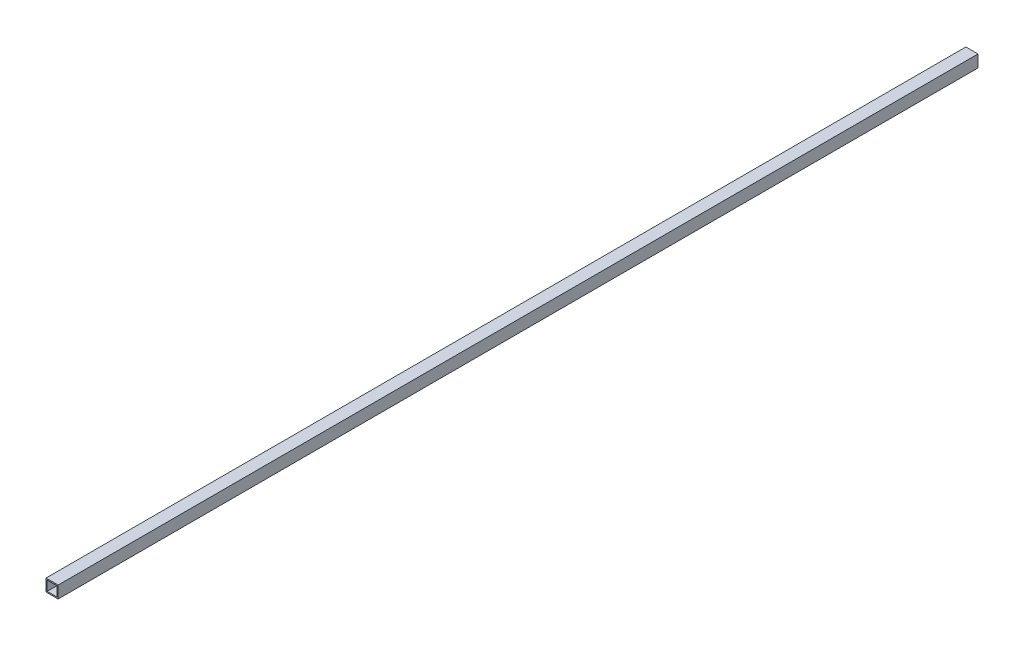
ISO-10303-21;
HEADER;
FILE_DESCRIPTION(('STEP AP214'),'2;1');
FILE_NAME('part.step','',(''),(''),'','','');
FILE_SCHEMA(('AUTOMOTIVE_DESIGN { 1 0 10303 214 1 1 1 1 }'));
ENDSEC;
DATA;
#1=APPLICATION_CONTEXT('core data for automotive mechanical design processes');
#2=APPLICATION_PROTOCOL_DEFINITION('international standard','automotive_design',2000,#1);
#3=PRODUCT_CONTEXT('',#1,'mechanical');
#4=PRODUCT('Part','Part','',(#3));
#5=PRODUCT_RELATED_PRODUCT_CATEGORY('part','',(#4));
#6=PRODUCT_DEFINITION_FORMATION('','',#4);
#7=PRODUCT_DEFINITION_CONTEXT('part definition',#1,'design');
#8=PRODUCT_DEFINITION('design','',#6,#7);
#9=PRODUCT_DEFINITION_SHAPE('','',#8);
#10=(LENGTH_UNIT() NAMED_UNIT(*) SI_UNIT(.MILLI.,.METRE.));
#11=(NAMED_UNIT(*) PLANE_ANGLE_UNIT() SI_UNIT($,.RADIAN.));
#12=(NAMED_UNIT(*) SI_UNIT($,.STERADIAN.) SOLID_ANGLE_UNIT());
#13=UNCERTAINTY_MEASURE_WITH_UNIT(LENGTH_MEASURE(1.E-05),#10,'distance_accuracy_value','');
#14=(GEOMETRIC_REPRESENTATION_CONTEXT(3) GLOBAL_UNCERTAINTY_ASSIGNED_CONTEXT((#13)) GLOBAL_UNIT_ASSIGNED_CONTEXT((#10,
#11,#12)) REPRESENTATION_CONTEXT('',''));
#15=CARTESIAN_POINT('',(0.,0.,0.));
#16=DIRECTION('',(0.,0.,1.));
#17=DIRECTION('',(1.,0.,0.));
#18=AXIS2_PLACEMENT_3D('',#15,#16,#17);
#19=CARTESIAN_POINT('',(0.,0.,781.));
#20=DIRECTION('',(0.,0.,1.));
#21=DIRECTION('',(1.,0.,0.));
#22=AXIS2_PLACEMENT_3D('',#19,#20,#21);
#23=PLANE('',#22);
#24=DIRECTION('',(1.,0.,0.));
#25=VECTOR('',#24,1.);
#26=CARTESIAN_POINT('',(-5.15,-5.15,781.));
#27=LINE('',#26,#25);
#28=CARTESIAN_POINT('',(-5.15,-5.15,781.));
#29=VERTEX_POINT('',#28);
#30=CARTESIAN_POINT('',(5.15,-5.15,781.));
#31=VERTEX_POINT('',#30);
#32=EDGE_CURVE('E134',#29,#31,#27,.T.);
#33=ORIENTED_EDGE('',*,*,#32,.T.);
#34=DIRECTION('',(0.,1.,0.));
#35=VECTOR('',#34,1.);
#36=CARTESIAN_POINT('',(5.15,-5.15,781.));
#37=LINE('',#36,#35);
#38=CARTESIAN_POINT('',(5.15,5.15,781.));
#39=VERTEX_POINT('',#38);
#40=EDGE_CURVE('E137',#31,#39,#37,.T.);
#41=ORIENTED_EDGE('',*,*,#40,.T.);
#42=DIRECTION('',(-1.,0.,0.));
#43=VECTOR('',#42,1.);
#44=CARTESIAN_POINT('',(-5.15,5.15,781.));
#45=LINE('',#44,#43);
#46=CARTESIAN_POINT('',(-5.15,5.15,781.));
#47=VERTEX_POINT('',#46);
#48=EDGE_CURVE('E140',#39,#47,#45,.T.);
#49=ORIENTED_EDGE('',*,*,#48,.T.);
#50=DIRECTION('',(0.,-1.,0.));
#51=VECTOR('',#50,1.);
#52=CARTESIAN_POINT('',(-5.15,-5.15,781.));
#53=LINE('',#52,#51);
#54=EDGE_CURVE('E142',#47,#29,#53,.T.);
#55=ORIENTED_EDGE('',*,*,#54,.T.);
#56=EDGE_LOOP('',(#33,#41,#49,#55));
#57=FACE_BOUND('',#56,.T.);
#58=DIRECTION('',(-1.,0.,0.));
#59=VECTOR('',#58,1.);
#60=CARTESIAN_POINT('',(-4.15,4.15,781.));
#61=LINE('',#60,#59);
#62=CARTESIAN_POINT('',(4.15,4.15,781.));
#63=VERTEX_POINT('',#62);
#64=CARTESIAN_POINT('',(-4.15,4.15,781.));
#65=VERTEX_POINT('',#64);
#66=EDGE_CURVE('E106',#63,#65,#61,.T.);
#67=ORIENTED_EDGE('',*,*,#66,.F.);
#68=DIRECTION('',(0.,1.,0.));
#69=VECTOR('',#68,1.);
#70=CARTESIAN_POINT('',(4.15,-4.15,781.));
#71=LINE('',#70,#69);
#72=CARTESIAN_POINT('',(4.15,-4.15,781.));
#73=VERTEX_POINT('',#72);
#74=EDGE_CURVE('E98',#73,#63,#71,.T.);
#75=ORIENTED_EDGE('',*,*,#74,.F.);
#76=DIRECTION('',(1.,0.,0.));
#77=VECTOR('',#76,1.);
#78=CARTESIAN_POINT('',(-4.15,-4.15,781.));
#79=LINE('',#78,#77);
#80=CARTESIAN_POINT('',(-4.15,-4.15,781.));
#81=VERTEX_POINT('',#80);
#82=EDGE_CURVE('E120',#81,#73,#79,.T.);
#83=ORIENTED_EDGE('',*,*,#82,.F.);
#84=DIRECTION('',(0.,-1.,0.));
#85=VECTOR('',#84,1.);
#86=CARTESIAN_POINT('',(-4.15,-4.15,781.));
#87=LINE('',#86,#85);
#88=EDGE_CURVE('E118',#65,#81,#87,.T.);
#89=ORIENTED_EDGE('',*,*,#88,.F.);
#90=EDGE_LOOP('',(#67,#75,#83,#89));
#91=FACE_BOUND('',#90,.T.);
#92=ADVANCED_FACE('F33',(#57,#91),#23,.T.);
#93=CARTESIAN_POINT('',(0.,0.,0.));
#94=DIRECTION('',(0.,0.,1.));
#95=DIRECTION('',(1.,0.,0.));
#96=AXIS2_PLACEMENT_3D('',#93,#94,#95);
#97=PLANE('',#96);
#98=DIRECTION('',(1.,0.,0.));
#99=VECTOR('',#98,1.);
#100=CARTESIAN_POINT('',(-5.15,-5.15,0.));
#101=LINE('',#100,#99);
#102=CARTESIAN_POINT('',(-5.15,-5.15,0.));
#103=VERTEX_POINT('',#102);
#104=CARTESIAN_POINT('',(5.15,-5.15,0.));
#105=VERTEX_POINT('',#104);
#106=EDGE_CURVE('E114',#103,#105,#101,.T.);
#107=ORIENTED_EDGE('',*,*,#106,.F.);
#108=DIRECTION('',(0.,-1.,0.));
#109=VECTOR('',#108,1.);
#110=CARTESIAN_POINT('',(-5.15,-5.15,0.));
#111=LINE('',#110,#109);
#112=CARTESIAN_POINT('',(-5.15,5.15,0.));
#113=VERTEX_POINT('',#112);
#114=EDGE_CURVE('E138',#113,#103,#111,.T.);
#115=ORIENTED_EDGE('',*,*,#114,.F.);
#116=DIRECTION('',(-1.,0.,0.));
#117=VECTOR('',#116,1.);
#118=CARTESIAN_POINT('',(-5.15,5.15,0.));
#119=LINE('',#118,#117);
#120=CARTESIAN_POINT('',(5.15,5.15,0.));
#121=VERTEX_POINT('',#120);
#122=EDGE_CURVE('E149',#121,#113,#119,.T.);
#123=ORIENTED_EDGE('',*,*,#122,.F.);
#124=DIRECTION('',(0.,1.,0.));
#125=VECTOR('',#124,1.);
#126=CARTESIAN_POINT('',(5.15,-5.15,0.));
#127=LINE('',#126,#125);
#128=EDGE_CURVE('E147',#105,#121,#127,.T.);
#129=ORIENTED_EDGE('',*,*,#128,.F.);
#130=EDGE_LOOP('',(#107,#115,#123,#129));
#131=FACE_BOUND('',#130,.T.);
#132=DIRECTION('',(0.,1.,0.));
#133=VECTOR('',#132,1.);
#134=CARTESIAN_POINT('',(4.15,-4.15,0.));
#135=LINE('',#134,#133);
#136=CARTESIAN_POINT('',(4.15,-4.15,0.));
#137=VERTEX_POINT('',#136);
#138=CARTESIAN_POINT('',(4.15,4.15,0.));
#139=VERTEX_POINT('',#138);
#140=EDGE_CURVE('E56',#137,#139,#135,.T.);
#141=ORIENTED_EDGE('',*,*,#140,.T.);
#142=DIRECTION('',(-1.,0.,0.));
#143=VECTOR('',#142,1.);
#144=CARTESIAN_POINT('',(-4.15,4.15,0.));
#145=LINE('',#144,#143);
#146=CARTESIAN_POINT('',(-4.15,4.15,0.));
#147=VERTEX_POINT('',#146);
#148=EDGE_CURVE('E113',#139,#147,#145,.T.);
#149=ORIENTED_EDGE('',*,*,#148,.T.);
#150=DIRECTION('',(0.,-1.,0.));
#151=VECTOR('',#150,1.);
#152=CARTESIAN_POINT('',(-4.15,-4.15,0.));
#153=LINE('',#152,#151);
#154=CARTESIAN_POINT('',(-4.15,-4.15,0.));
#155=VERTEX_POINT('',#154);
#156=EDGE_CURVE('E126',#147,#155,#153,.T.);
#157=ORIENTED_EDGE('',*,*,#156,.T.);
#158=DIRECTION('',(1.,0.,0.));
#159=VECTOR('',#158,1.);
#160=CARTESIAN_POINT('',(-4.15,-4.15,0.));
#161=LINE('',#160,#159);
#162=EDGE_CURVE('E107',#155,#137,#161,.T.);
#163=ORIENTED_EDGE('',*,*,#162,.T.);
#164=EDGE_LOOP('',(#141,#149,#157,#163));
#165=FACE_BOUND('',#164,.T.);
#166=ADVANCED_FACE('F167',(#131,#165),#97,.F.);
#167=CARTESIAN_POINT('',(-5.15,-5.15,781.));
#168=DIRECTION('',(0.,1.,0.));
#169=DIRECTION('',(0.,0.,1.));
#170=AXIS2_PLACEMENT_3D('',#167,#168,#169);
#171=PLANE('',#170);
#172=ORIENTED_EDGE('',*,*,#106,.T.);
#173=DIRECTION('',(0.,0.,-1.));
#174=VECTOR('',#173,1.);
#175=CARTESIAN_POINT('',(5.15,-5.15,781.));
#176=LINE('',#175,#174);
#177=EDGE_CURVE('E11',#31,#105,#176,.T.);
#178=ORIENTED_EDGE('',*,*,#177,.F.);
#179=ORIENTED_EDGE('',*,*,#32,.F.);
#180=DIRECTION('',(0.,0.,-1.));
#181=VECTOR('',#180,1.);
#182=CARTESIAN_POINT('',(-5.15,-5.15,781.));
#183=LINE('',#182,#181);
#184=EDGE_CURVE('E144',#29,#103,#183,.T.);
#185=ORIENTED_EDGE('',*,*,#184,.T.);
#186=EDGE_LOOP('',(#172,#178,#179,#185));
#187=FACE_BOUND('',#186,.T.);
#188=ADVANCED_FACE('F35',(#187),#171,.F.);
#189=CARTESIAN_POINT('',(5.15,-5.15,781.));
#190=DIRECTION('',(-1.,0.,0.));
#191=DIRECTION('',(0.,0.,1.));
#192=AXIS2_PLACEMENT_3D('',#189,#190,#191);
#193=PLANE('',#192);
#194=ORIENTED_EDGE('',*,*,#128,.T.);
#195=DIRECTION('',(0.,0.,-1.));
#196=VECTOR('',#195,1.);
#197=CARTESIAN_POINT('',(5.15,5.15,781.));
#198=LINE('',#197,#196);
#199=EDGE_CURVE('E41',#39,#121,#198,.T.);
#200=ORIENTED_EDGE('',*,*,#199,.F.);
#201=ORIENTED_EDGE('',*,*,#40,.F.);
#202=ORIENTED_EDGE('',*,*,#177,.T.);
#203=EDGE_LOOP('',(#194,#200,#201,#202));
#204=FACE_BOUND('',#203,.T.);
#205=ADVANCED_FACE('F177',(#204),#193,.F.);
#206=CARTESIAN_POINT('',(-5.15,5.15,781.));
#207=DIRECTION('',(0.,-1.,0.));
#208=DIRECTION('',(0.,0.,-1.));
#209=AXIS2_PLACEMENT_3D('',#206,#207,#208);
#210=PLANE('',#209);
#211=ORIENTED_EDGE('',*,*,#122,.T.);
#212=DIRECTION('',(0.,0.,-1.));
#213=VECTOR('',#212,1.);
#214=CARTESIAN_POINT('',(-5.15,5.15,781.));
#215=LINE('',#214,#213);
#216=EDGE_CURVE('E154',#47,#113,#215,.T.);
#217=ORIENTED_EDGE('',*,*,#216,.F.);
#218=ORIENTED_EDGE('',*,*,#48,.F.);
#219=ORIENTED_EDGE('',*,*,#199,.T.);
#220=EDGE_LOOP('',(#211,#217,#218,#219));
#221=FACE_BOUND('',#220,.T.);
#222=ADVANCED_FACE('F161',(#221),#210,.F.);
#223=CARTESIAN_POINT('',(-5.15,-5.15,781.));
#224=DIRECTION('',(1.,0.,0.));
#225=DIRECTION('',(0.,0.,-1.));
#226=AXIS2_PLACEMENT_3D('',#223,#224,#225);
#227=PLANE('',#226);
#228=ORIENTED_EDGE('',*,*,#114,.T.);
#229=ORIENTED_EDGE('',*,*,#184,.F.);
#230=ORIENTED_EDGE('',*,*,#54,.F.);
#231=ORIENTED_EDGE('',*,*,#216,.T.);
#232=EDGE_LOOP('',(#228,#229,#230,#231));
#233=FACE_BOUND('',#232,.T.);
#234=ADVANCED_FACE('F171',(#233),#227,.F.);
#235=CARTESIAN_POINT('',(4.15,-4.15,781.));
#236=DIRECTION('',(-1.,0.,0.));
#237=DIRECTION('',(0.,0.,1.));
#238=AXIS2_PLACEMENT_3D('',#235,#236,#237);
#239=PLANE('',#238);
#240=ORIENTED_EDGE('',*,*,#140,.F.);
#241=DIRECTION('',(0.,0.,-1.));
#242=VECTOR('',#241,1.);
#243=CARTESIAN_POINT('',(4.15,-4.15,781.));
#244=LINE('',#243,#242);
#245=EDGE_CURVE('E102',#73,#137,#244,.T.);
#246=ORIENTED_EDGE('',*,*,#245,.F.);
#247=ORIENTED_EDGE('',*,*,#74,.T.);
#248=DIRECTION('',(0.,0.,-1.));
#249=VECTOR('',#248,1.);
#250=CARTESIAN_POINT('',(4.15,4.15,781.));
#251=LINE('',#250,#249);
#252=EDGE_CURVE('E101',#63,#139,#251,.T.);
#253=ORIENTED_EDGE('',*,*,#252,.T.);
#254=EDGE_LOOP('',(#240,#246,#247,#253));
#255=FACE_BOUND('',#254,.T.);
#256=ADVANCED_FACE('F100',(#255),#239,.T.);
#257=CARTESIAN_POINT('',(-4.15,4.15,781.));
#258=DIRECTION('',(0.,-1.,0.));
#259=DIRECTION('',(0.,0.,-1.));
#260=AXIS2_PLACEMENT_3D('',#257,#258,#259);
#261=PLANE('',#260);
#262=ORIENTED_EDGE('',*,*,#148,.F.);
#263=ORIENTED_EDGE('',*,*,#252,.F.);
#264=ORIENTED_EDGE('',*,*,#66,.T.);
#265=DIRECTION('',(0.,0.,-1.));
#266=VECTOR('',#265,1.);
#267=CARTESIAN_POINT('',(-4.15,4.15,781.));
#268=LINE('',#267,#266);
#269=EDGE_CURVE('E115',#65,#147,#268,.T.);
#270=ORIENTED_EDGE('',*,*,#269,.T.);
#271=EDGE_LOOP('',(#262,#263,#264,#270));
#272=FACE_BOUND('',#271,.T.);
#273=ADVANCED_FACE('F110',(#272),#261,.T.);
#274=CARTESIAN_POINT('',(-4.15,-4.15,781.));
#275=DIRECTION('',(1.,0.,0.));
#276=DIRECTION('',(0.,0.,-1.));
#277=AXIS2_PLACEMENT_3D('',#274,#275,#276);
#278=PLANE('',#277);
#279=ORIENTED_EDGE('',*,*,#156,.F.);
#280=ORIENTED_EDGE('',*,*,#269,.F.);
#281=ORIENTED_EDGE('',*,*,#88,.T.);
#282=DIRECTION('',(0.,0.,-1.));
#283=VECTOR('',#282,1.);
#284=CARTESIAN_POINT('',(-4.15,-4.15,781.));
#285=LINE('',#284,#283);
#286=EDGE_CURVE('E48',#81,#155,#285,.T.);
#287=ORIENTED_EDGE('',*,*,#286,.T.);
#288=EDGE_LOOP('',(#279,#280,#281,#287));
#289=FACE_BOUND('',#288,.T.);
#290=ADVANCED_FACE('F200',(#289),#278,.T.);
#291=CARTESIAN_POINT('',(-4.15,-4.15,781.));
#292=DIRECTION('',(0.,1.,0.));
#293=DIRECTION('',(0.,0.,1.));
#294=AXIS2_PLACEMENT_3D('',#291,#292,#293);
#295=PLANE('',#294);
#296=ORIENTED_EDGE('',*,*,#162,.F.);
#297=ORIENTED_EDGE('',*,*,#286,.F.);
#298=ORIENTED_EDGE('',*,*,#82,.T.);
#299=ORIENTED_EDGE('',*,*,#245,.T.);
#300=EDGE_LOOP('',(#296,#297,#298,#299));
#301=FACE_BOUND('',#300,.T.);
#302=ADVANCED_FACE('F204',(#301),#295,.T.);
#303=CLOSED_SHELL('',(#92,#166,#188,#205,#222,#234,#256,#273,#290,#302));
#304=MANIFOLD_SOLID_BREP('B2',#303);
#305=ADVANCED_BREP_SHAPE_REPRESENTATION('',(#18,#304),#14);
#306=SHAPE_DEFINITION_REPRESENTATION(#9,#305);
ENDSEC;
END-ISO-10303-21;
